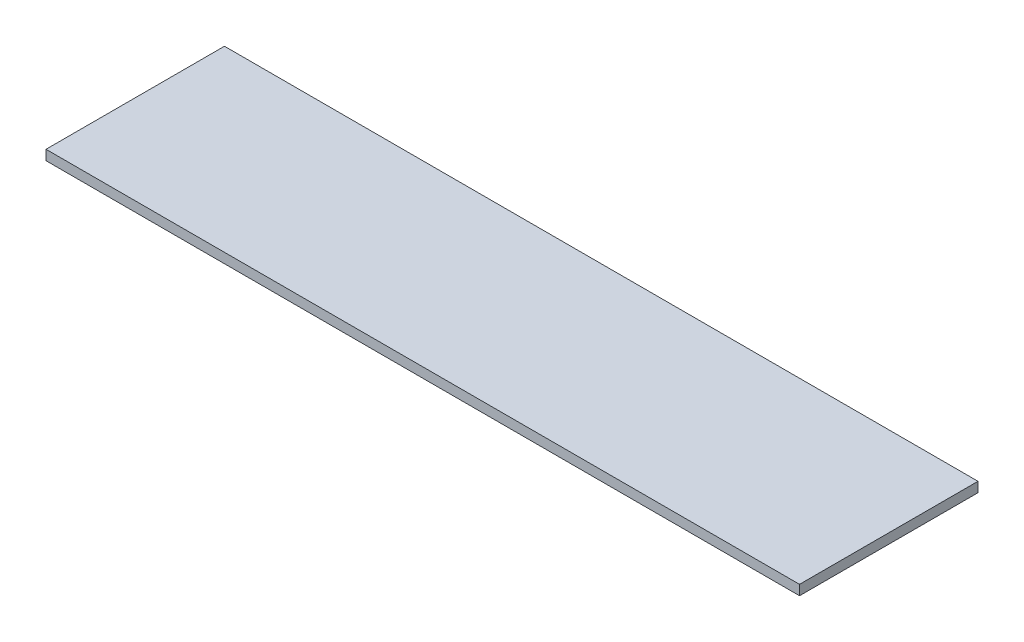
ISO-10303-21;
HEADER;
FILE_DESCRIPTION(('STEP AP214'),'2;1');
FILE_NAME('part.step','',(''),(''),'','','');
FILE_SCHEMA(('AUTOMOTIVE_DESIGN { 1 0 10303 214 1 1 1 1 }'));
ENDSEC;
DATA;
#1=APPLICATION_CONTEXT('core data for automotive mechanical design processes');
#2=APPLICATION_PROTOCOL_DEFINITION('international standard','automotive_design',2000,#1);
#3=PRODUCT_CONTEXT('',#1,'mechanical');
#4=PRODUCT('Part','Part','',(#3));
#5=PRODUCT_RELATED_PRODUCT_CATEGORY('part','',(#4));
#6=PRODUCT_DEFINITION_FORMATION('','',#4);
#7=PRODUCT_DEFINITION_CONTEXT('part definition',#1,'design');
#8=PRODUCT_DEFINITION('design','',#6,#7);
#9=PRODUCT_DEFINITION_SHAPE('','',#8);
#10=(LENGTH_UNIT() NAMED_UNIT(*) SI_UNIT(.MILLI.,.METRE.));
#11=(NAMED_UNIT(*) PLANE_ANGLE_UNIT() SI_UNIT($,.RADIAN.));
#12=(NAMED_UNIT(*) SI_UNIT($,.STERADIAN.) SOLID_ANGLE_UNIT());
#13=UNCERTAINTY_MEASURE_WITH_UNIT(LENGTH_MEASURE(1.E-05),#10,'distance_accuracy_value','');
#14=(GEOMETRIC_REPRESENTATION_CONTEXT(3) GLOBAL_UNCERTAINTY_ASSIGNED_CONTEXT((#13)) GLOBAL_UNIT_ASSIGNED_CONTEXT((#10,
#11,#12)) REPRESENTATION_CONTEXT('',''));
#15=CARTESIAN_POINT('',(0.,0.,0.));
#16=DIRECTION('',(0.,0.,1.));
#17=DIRECTION('',(1.,0.,0.));
#18=AXIS2_PLACEMENT_3D('',#15,#16,#17);
#19=CARTESIAN_POINT('',(-120.65,3.175,0.));
#20=DIRECTION('',(1.,0.,0.));
#21=DIRECTION('',(0.,0.,-1.));
#22=AXIS2_PLACEMENT_3D('',#19,#20,#21);
#23=PLANE('',#22);
#24=DIRECTION('',(0.,0.,1.));
#25=VECTOR('',#24,1.);
#26=CARTESIAN_POINT('',(-120.65,0.,0.));
#27=LINE('',#26,#25);
#28=CARTESIAN_POINT('',(-120.65,0.,-57.15));
#29=VERTEX_POINT('',#28);
#30=CARTESIAN_POINT('',(-120.65,0.,0.));
#31=VERTEX_POINT('',#30);
#32=EDGE_CURVE('E98',#29,#31,#27,.T.);
#33=ORIENTED_EDGE('',*,*,#32,.T.);
#34=DIRECTION('',(0.,-1.,0.));
#35=VECTOR('',#34,1.);
#36=CARTESIAN_POINT('',(-120.65,3.175,0.));
#37=LINE('',#36,#35);
#38=CARTESIAN_POINT('',(-120.65,3.175,0.));
#39=VERTEX_POINT('',#38);
#40=EDGE_CURVE('E11',#39,#31,#37,.T.);
#41=ORIENTED_EDGE('',*,*,#40,.F.);
#42=DIRECTION('',(0.,0.,1.));
#43=VECTOR('',#42,1.);
#44=CARTESIAN_POINT('',(-120.65,3.175,0.));
#45=LINE('',#44,#43);
#46=CARTESIAN_POINT('',(-120.65,3.175,-57.15));
#47=VERTEX_POINT('',#46);
#48=EDGE_CURVE('E86',#47,#39,#45,.T.);
#49=ORIENTED_EDGE('',*,*,#48,.F.);
#50=DIRECTION('',(0.,-1.,0.));
#51=VECTOR('',#50,1.);
#52=CARTESIAN_POINT('',(-120.65,3.175,-57.15));
#53=LINE('',#52,#51);
#54=EDGE_CURVE('E94',#47,#29,#53,.T.);
#55=ORIENTED_EDGE('',*,*,#54,.T.);
#56=EDGE_LOOP('',(#33,#41,#49,#55));
#57=FACE_BOUND('',#56,.T.);
#58=ADVANCED_FACE('F35',(#57),#23,.F.);
#59=CARTESIAN_POINT('',(-120.65,3.175,0.));
#60=DIRECTION('',(0.,0.,-1.));
#61=DIRECTION('',(-1.,0.,0.));
#62=AXIS2_PLACEMENT_3D('',#59,#60,#61);
#63=PLANE('',#62);
#64=DIRECTION('',(1.,0.,0.));
#65=VECTOR('',#64,1.);
#66=CARTESIAN_POINT('',(-120.65,0.,0.));
#67=LINE('',#66,#65);
#68=CARTESIAN_POINT('',(120.65,0.,0.));
#69=VERTEX_POINT('',#68);
#70=EDGE_CURVE('E90',#31,#69,#67,.T.);
#71=ORIENTED_EDGE('',*,*,#70,.T.);
#72=DIRECTION('',(0.,-1.,0.));
#73=VECTOR('',#72,1.);
#74=CARTESIAN_POINT('',(120.65,3.175,0.));
#75=LINE('',#74,#73);
#76=CARTESIAN_POINT('',(120.65,3.175,0.));
#77=VERTEX_POINT('',#76);
#78=EDGE_CURVE('E43',#77,#69,#75,.T.);
#79=ORIENTED_EDGE('',*,*,#78,.F.);
#80=DIRECTION('',(1.,0.,0.));
#81=VECTOR('',#80,1.);
#82=CARTESIAN_POINT('',(-120.65,3.175,0.));
#83=LINE('',#82,#81);
#84=EDGE_CURVE('E81',#39,#77,#83,.T.);
#85=ORIENTED_EDGE('',*,*,#84,.F.);
#86=ORIENTED_EDGE('',*,*,#40,.T.);
#87=EDGE_LOOP('',(#71,#79,#85,#86));
#88=FACE_BOUND('',#87,.T.);
#89=ADVANCED_FACE('F89',(#88),#63,.F.);
#90=CARTESIAN_POINT('',(120.65,3.175,0.));
#91=DIRECTION('',(-1.,0.,0.));
#92=DIRECTION('',(0.,0.,1.));
#93=AXIS2_PLACEMENT_3D('',#90,#91,#92);
#94=PLANE('',#93);
#95=DIRECTION('',(0.,0.,-1.));
#96=VECTOR('',#95,1.);
#97=CARTESIAN_POINT('',(120.65,0.,0.));
#98=LINE('',#97,#96);
#99=CARTESIAN_POINT('',(120.65,0.,-57.15));
#100=VERTEX_POINT('',#99);
#101=EDGE_CURVE('E68',#69,#100,#98,.T.);
#102=ORIENTED_EDGE('',*,*,#101,.T.);
#103=DIRECTION('',(0.,-1.,0.));
#104=VECTOR('',#103,1.);
#105=CARTESIAN_POINT('',(120.65,3.175,-57.15));
#106=LINE('',#105,#104);
#107=CARTESIAN_POINT('',(120.65,3.175,-57.15));
#108=VERTEX_POINT('',#107);
#109=EDGE_CURVE('E91',#108,#100,#106,.T.);
#110=ORIENTED_EDGE('',*,*,#109,.F.);
#111=DIRECTION('',(0.,0.,-1.));
#112=VECTOR('',#111,1.);
#113=CARTESIAN_POINT('',(120.65,3.175,0.));
#114=LINE('',#113,#112);
#115=EDGE_CURVE('E84',#77,#108,#114,.T.);
#116=ORIENTED_EDGE('',*,*,#115,.F.);
#117=ORIENTED_EDGE('',*,*,#78,.T.);
#118=EDGE_LOOP('',(#102,#110,#116,#117));
#119=FACE_BOUND('',#118,.T.);
#120=ADVANCED_FACE('F92',(#119),#94,.F.);
#121=CARTESIAN_POINT('',(-120.65,3.175,-57.15));
#122=DIRECTION('',(0.,0.,1.));
#123=DIRECTION('',(1.,0.,0.));
#124=AXIS2_PLACEMENT_3D('',#121,#122,#123);
#125=PLANE('',#124);
#126=DIRECTION('',(-1.,0.,0.));
#127=VECTOR('',#126,1.);
#128=CARTESIAN_POINT('',(-120.65,0.,-57.15));
#129=LINE('',#128,#127);
#130=EDGE_CURVE('E74',#100,#29,#129,.T.);
#131=ORIENTED_EDGE('',*,*,#130,.T.);
#132=ORIENTED_EDGE('',*,*,#54,.F.);
#133=DIRECTION('',(-1.,0.,0.));
#134=VECTOR('',#133,1.);
#135=CARTESIAN_POINT('',(-120.65,3.175,-57.15));
#136=LINE('',#135,#134);
#137=EDGE_CURVE('E51',#108,#47,#136,.T.);
#138=ORIENTED_EDGE('',*,*,#137,.F.);
#139=ORIENTED_EDGE('',*,*,#109,.T.);
#140=EDGE_LOOP('',(#131,#132,#138,#139));
#141=FACE_BOUND('',#140,.T.);
#142=ADVANCED_FACE('F105',(#141),#125,.F.);
#143=CARTESIAN_POINT('',(0.,3.175,0.));
#144=DIRECTION('',(0.,-1.,0.));
#145=DIRECTION('',(0.,0.,-1.));
#146=AXIS2_PLACEMENT_3D('',#143,#144,#145);
#147=PLANE('',#146);
#148=ORIENTED_EDGE('',*,*,#48,.T.);
#149=ORIENTED_EDGE('',*,*,#84,.T.);
#150=ORIENTED_EDGE('',*,*,#115,.T.);
#151=ORIENTED_EDGE('',*,*,#137,.T.);
#152=EDGE_LOOP('',(#148,#149,#150,#151));
#153=FACE_BOUND('',#152,.T.);
#154=ADVANCED_FACE('F82',(#153),#147,.F.);
#155=CARTESIAN_POINT('',(0.,0.,0.));
#156=DIRECTION('',(0.,-1.,0.));
#157=DIRECTION('',(0.,0.,-1.));
#158=AXIS2_PLACEMENT_3D('',#155,#156,#157);
#159=PLANE('',#158);
#160=ORIENTED_EDGE('',*,*,#32,.F.);
#161=ORIENTED_EDGE('',*,*,#130,.F.);
#162=ORIENTED_EDGE('',*,*,#101,.F.);
#163=ORIENTED_EDGE('',*,*,#70,.F.);
#164=EDGE_LOOP('',(#160,#161,#162,#163));
#165=FACE_BOUND('',#164,.T.);
#166=ADVANCED_FACE('F108',(#165),#159,.T.);
#167=CLOSED_SHELL('',(#58,#89,#120,#142,#154,#166));
#168=MANIFOLD_SOLID_BREP('B2',#167);
#169=ADVANCED_BREP_SHAPE_REPRESENTATION('',(#18,#168),#14);
#170=SHAPE_DEFINITION_REPRESENTATION(#9,#169);
ENDSEC;
END-ISO-10303-21;
